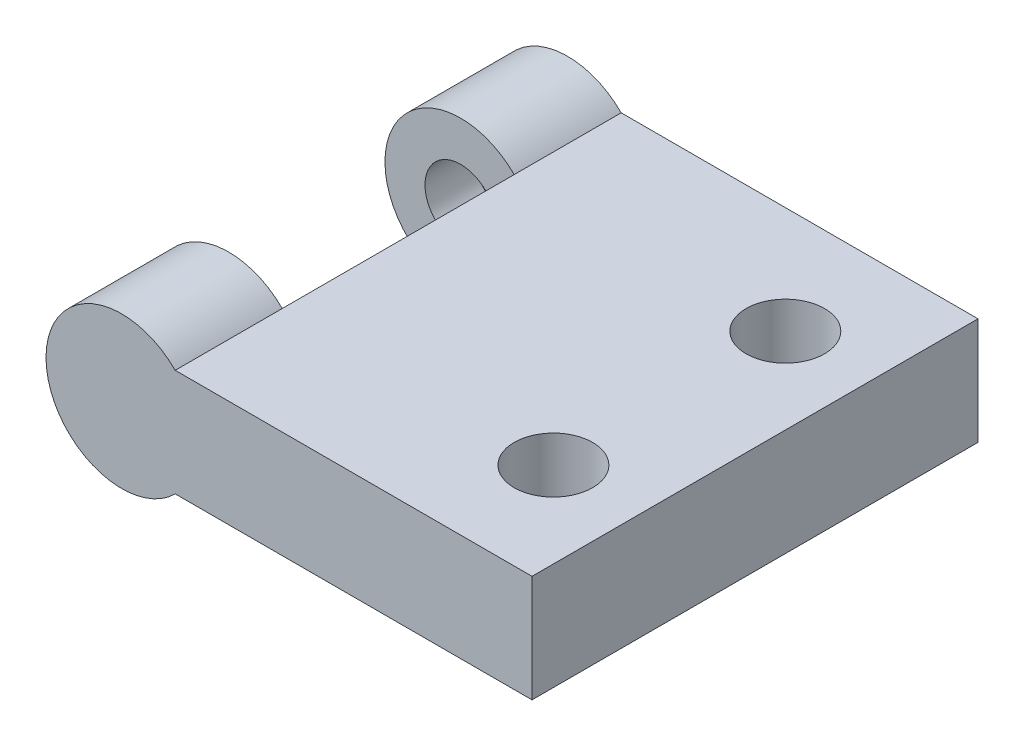
ISO-10303-21;
HEADER;
FILE_DESCRIPTION(('STEP AP214'),'2;1');
FILE_NAME('part.step','',(''),(''),'','','');
FILE_SCHEMA(('AUTOMOTIVE_DESIGN { 1 0 10303 214 1 1 1 1 }'));
ENDSEC;
DATA;
#1=APPLICATION_CONTEXT('core data for automotive mechanical design processes');
#2=APPLICATION_PROTOCOL_DEFINITION('international standard','automotive_design',2000,#1);
#3=PRODUCT_CONTEXT('',#1,'mechanical');
#4=PRODUCT('Part','Part','',(#3));
#5=PRODUCT_RELATED_PRODUCT_CATEGORY('part','',(#4));
#6=PRODUCT_DEFINITION_FORMATION('','',#4);
#7=PRODUCT_DEFINITION_CONTEXT('part definition',#1,'design');
#8=PRODUCT_DEFINITION('design','',#6,#7);
#9=PRODUCT_DEFINITION_SHAPE('','',#8);
#10=(LENGTH_UNIT() NAMED_UNIT(*) SI_UNIT(.MILLI.,.METRE.));
#11=(NAMED_UNIT(*) PLANE_ANGLE_UNIT() SI_UNIT($,.RADIAN.));
#12=(NAMED_UNIT(*) SI_UNIT($,.STERADIAN.) SOLID_ANGLE_UNIT());
#13=UNCERTAINTY_MEASURE_WITH_UNIT(LENGTH_MEASURE(1.E-05),#10,'distance_accuracy_value','');
#14=(GEOMETRIC_REPRESENTATION_CONTEXT(3) GLOBAL_UNCERTAINTY_ASSIGNED_CONTEXT((#13)) GLOBAL_UNIT_ASSIGNED_CONTEXT((#10,
#11,#12)) REPRESENTATION_CONTEXT('',''));
#15=CARTESIAN_POINT('',(0.,0.,0.));
#16=DIRECTION('',(0.,0.,1.));
#17=DIRECTION('',(1.,0.,0.));
#18=AXIS2_PLACEMENT_3D('',#15,#16,#17);
#19=CARTESIAN_POINT('',(0.,3.81,-15.875));
#20=DIRECTION('',(1.,0.,0.));
#21=DIRECTION('',(0.,0.,-1.));
#22=AXIS2_PLACEMENT_3D('',#19,#20,#21);
#23=PLANE('',#22);
#24=DIRECTION('',(0.,1.,0.));
#25=VECTOR('',#24,1.);
#26=CARTESIAN_POINT('',(0.,0.,-12.065));
#27=LINE('',#26,#25);
#28=CARTESIAN_POINT('',(0.,0.,-12.065));
#29=VERTEX_POINT('',#28);
#30=CARTESIAN_POINT('',(0.,3.81,-12.065));
#31=VERTEX_POINT('',#30);
#32=EDGE_CURVE('E97',#29,#31,#27,.T.);
#33=ORIENTED_EDGE('',*,*,#32,.F.);
#34=DIRECTION('',(0.,0.,1.));
#35=VECTOR('',#34,1.);
#36=CARTESIAN_POINT('',(0.,0.,-15.875));
#37=LINE('',#36,#35);
#38=CARTESIAN_POINT('',(0.,0.,-3.81));
#39=VERTEX_POINT('',#38);
#40=EDGE_CURVE('E85',#29,#39,#37,.T.);
#41=ORIENTED_EDGE('',*,*,#40,.T.);
#42=DIRECTION('',(0.,-1.,0.));
#43=VECTOR('',#42,1.);
#44=CARTESIAN_POINT('',(0.,0.,-3.81));
#45=LINE('',#44,#43);
#46=CARTESIAN_POINT('',(0.,3.81,-3.81));
#47=VERTEX_POINT('',#46);
#48=EDGE_CURVE('E122',#47,#39,#45,.T.);
#49=ORIENTED_EDGE('',*,*,#48,.F.);
#50=DIRECTION('',(0.,0.,1.));
#51=VECTOR('',#50,1.);
#52=CARTESIAN_POINT('',(0.,3.81,-15.875));
#53=LINE('',#52,#51);
#54=EDGE_CURVE('E49',#31,#47,#53,.T.);
#55=ORIENTED_EDGE('',*,*,#54,.F.);
#56=EDGE_LOOP('',(#33,#41,#49,#55));
#57=FACE_BOUND('',#56,.T.);
#58=ADVANCED_FACE('F35',(#57),#23,.F.);
#59=CARTESIAN_POINT('',(0.,3.81,0.));
#60=DIRECTION('',(0.,0.,-1.));
#61=DIRECTION('',(-1.,0.,0.));
#62=AXIS2_PLACEMENT_3D('',#59,#60,#61);
#63=PLANE('',#62);
#64=DIRECTION('',(1.,0.,0.));
#65=VECTOR('',#64,1.);
#66=CARTESIAN_POINT('',(0.,0.,0.));
#67=LINE('',#66,#65);
#68=CARTESIAN_POINT('',(0.,0.,0.));
#69=VERTEX_POINT('',#68);
#70=CARTESIAN_POINT('',(12.7,0.,0.));
#71=VERTEX_POINT('',#70);
#72=EDGE_CURVE('E108',#69,#71,#67,.T.);
#73=ORIENTED_EDGE('',*,*,#72,.T.);
#74=DIRECTION('',(0.,-1.,0.));
#75=VECTOR('',#74,1.);
#76=CARTESIAN_POINT('',(12.7,3.81,0.));
#77=LINE('',#76,#75);
#78=CARTESIAN_POINT('',(12.7,3.81,0.));
#79=VERTEX_POINT('',#78);
#80=EDGE_CURVE('E11',#79,#71,#77,.T.);
#81=ORIENTED_EDGE('',*,*,#80,.F.);
#82=DIRECTION('',(1.,0.,0.));
#83=VECTOR('',#82,1.);
#84=CARTESIAN_POINT('',(0.,3.81,0.));
#85=LINE('',#84,#83);
#86=CARTESIAN_POINT('',(0.,3.81,0.));
#87=VERTEX_POINT('',#86);
#88=EDGE_CURVE('E145',#87,#79,#85,.T.);
#89=ORIENTED_EDGE('',*,*,#88,.F.);
#90=CARTESIAN_POINT('',(-1.905,1.905,0.));
#91=DIRECTION('',(0.,0.,1.));
#92=DIRECTION('',(1.,0.,0.));
#93=AXIS2_PLACEMENT_3D('',#90,#91,#92);
#94=CIRCLE('',#93,2.69407683632075);
#95=EDGE_CURVE('E120',#87,#69,#94,.T.);
#96=ORIENTED_EDGE('',*,*,#95,.T.);
#97=EDGE_LOOP('',(#73,#81,#89,#96));
#98=FACE_BOUND('',#97,.T.);
#99=ADVANCED_FACE('F167',(#98),#63,.F.);
#100=CARTESIAN_POINT('',(12.7,3.81,0.));
#101=DIRECTION('',(-1.,0.,0.));
#102=DIRECTION('',(0.,0.,1.));
#103=AXIS2_PLACEMENT_3D('',#100,#101,#102);
#104=PLANE('',#103);
#105=DIRECTION('',(0.,0.,-1.));
#106=VECTOR('',#105,1.);
#107=CARTESIAN_POINT('',(12.7,0.,0.));
#108=LINE('',#107,#106);
#109=CARTESIAN_POINT('',(12.7,0.,-15.875));
#110=VERTEX_POINT('',#109);
#111=EDGE_CURVE('E152',#71,#110,#108,.T.);
#112=ORIENTED_EDGE('',*,*,#111,.T.);
#113=DIRECTION('',(0.,-1.,0.));
#114=VECTOR('',#113,1.);
#115=CARTESIAN_POINT('',(12.7,3.81,-15.875));
#116=LINE('',#115,#114);
#117=CARTESIAN_POINT('',(12.7,3.81,-15.875));
#118=VERTEX_POINT('',#117);
#119=EDGE_CURVE('E42',#118,#110,#116,.T.);
#120=ORIENTED_EDGE('',*,*,#119,.F.);
#121=DIRECTION('',(0.,0.,-1.));
#122=VECTOR('',#121,1.);
#123=CARTESIAN_POINT('',(12.7,3.81,0.));
#124=LINE('',#123,#122);
#125=EDGE_CURVE('E147',#79,#118,#124,.T.);
#126=ORIENTED_EDGE('',*,*,#125,.F.);
#127=ORIENTED_EDGE('',*,*,#80,.T.);
#128=EDGE_LOOP('',(#112,#120,#126,#127));
#129=FACE_BOUND('',#128,.T.);
#130=ADVANCED_FACE('F163',(#129),#104,.F.);
#131=CARTESIAN_POINT('',(12.7,3.81,-15.875));
#132=DIRECTION('',(0.,0.,1.));
#133=DIRECTION('',(1.,0.,0.));
#134=AXIS2_PLACEMENT_3D('',#131,#132,#133);
#135=PLANE('',#134);
#136=DIRECTION('',(-1.,0.,0.));
#137=VECTOR('',#136,1.);
#138=CARTESIAN_POINT('',(12.7,0.,-15.875));
#139=LINE('',#138,#137);
#140=CARTESIAN_POINT('',(0.,0.,-15.875));
#141=VERTEX_POINT('',#140);
#142=EDGE_CURVE('E154',#110,#141,#139,.T.);
#143=ORIENTED_EDGE('',*,*,#142,.T.);
#144=CARTESIAN_POINT('',(-1.90499999999999,1.905,-15.875));
#145=DIRECTION('',(0.,0.,-1.));
#146=DIRECTION('',(-1.,0.,0.));
#147=AXIS2_PLACEMENT_3D('',#144,#145,#146);
#148=CIRCLE('',#147,2.69407683632074);
#149=CARTESIAN_POINT('',(0.,3.81,-15.875));
#150=VERTEX_POINT('',#149);
#151=EDGE_CURVE('E102',#141,#150,#148,.T.);
#152=ORIENTED_EDGE('',*,*,#151,.T.);
#153=DIRECTION('',(-1.,0.,0.));
#154=VECTOR('',#153,1.);
#155=CARTESIAN_POINT('',(12.7,3.81,-15.875));
#156=LINE('',#155,#154);
#157=EDGE_CURVE('E149',#118,#150,#156,.T.);
#158=ORIENTED_EDGE('',*,*,#157,.F.);
#159=ORIENTED_EDGE('',*,*,#119,.T.);
#160=EDGE_LOOP('',(#143,#152,#158,#159));
#161=FACE_BOUND('',#160,.T.);
#162=ADVANCED_FACE('F159',(#161),#135,.F.);
#163=CARTESIAN_POINT('',(0.,3.81,0.));
#164=DIRECTION('',(0.,1.,0.));
#165=DIRECTION('',(0.,0.,1.));
#166=AXIS2_PLACEMENT_3D('',#163,#164,#165);
#167=PLANE('',#166);
#168=CARTESIAN_POINT('',(9.652,3.81,-3.81));
#169=DIRECTION('',(0.,1.,0.));
#170=DIRECTION('',(0.,0.,1.));
#171=AXIS2_PLACEMENT_3D('',#168,#169,#170);
#172=CIRCLE('',#171,1.397);
#173=CARTESIAN_POINT('',(9.652,3.81,-2.413));
#174=VERTEX_POINT('',#173);
#175=EDGE_CURVE('E135',#174,#174,#172,.T.);
#176=ORIENTED_EDGE('',*,*,#175,.F.);
#177=EDGE_LOOP('',(#176));
#178=FACE_BOUND('',#177,.T.);
#179=CARTESIAN_POINT('',(9.65200000000001,3.81,-12.065));
#180=DIRECTION('',(0.,1.,0.));
#181=DIRECTION('',(0.,0.,1.));
#182=AXIS2_PLACEMENT_3D('',#179,#180,#181);
#183=CIRCLE('',#182,1.397);
#184=CARTESIAN_POINT('',(9.65200000000001,3.81,-10.668));
#185=VERTEX_POINT('',#184);
#186=EDGE_CURVE('E131',#185,#185,#183,.T.);
#187=ORIENTED_EDGE('',*,*,#186,.F.);
#188=EDGE_LOOP('',(#187));
#189=FACE_BOUND('',#188,.T.);
#190=EDGE_CURVE('E143',#150,#31,#53,.T.);
#191=ORIENTED_EDGE('',*,*,#190,.T.);
#192=ORIENTED_EDGE('',*,*,#54,.T.);
#193=DIRECTION('',(0.,0.,1.));
#194=VECTOR('',#193,1.);
#195=CARTESIAN_POINT('',(0.,3.81,-3.81));
#196=LINE('',#195,#194);
#197=EDGE_CURVE('E127',#47,#87,#196,.T.);
#198=ORIENTED_EDGE('',*,*,#197,.T.);
#199=ORIENTED_EDGE('',*,*,#88,.T.);
#200=ORIENTED_EDGE('',*,*,#125,.T.);
#201=ORIENTED_EDGE('',*,*,#157,.T.);
#202=EDGE_LOOP('',(#191,#192,#198,#199,#200,#201));
#203=FACE_BOUND('',#202,.T.);
#204=ADVANCED_FACE('F200',(#178,#189,#203),#167,.T.);
#205=CARTESIAN_POINT('',(0.,0.,0.));
#206=DIRECTION('',(0.,1.,0.));
#207=DIRECTION('',(0.,0.,1.));
#208=AXIS2_PLACEMENT_3D('',#205,#206,#207);
#209=PLANE('',#208);
#210=CARTESIAN_POINT('',(9.652,0.,-3.81));
#211=DIRECTION('',(0.,1.,0.));
#212=DIRECTION('',(0.,0.,1.));
#213=AXIS2_PLACEMENT_3D('',#210,#211,#212);
#214=CIRCLE('',#213,1.397);
#215=CARTESIAN_POINT('',(9.652,0.,-2.413));
#216=VERTEX_POINT('',#215);
#217=EDGE_CURVE('E94',#216,#216,#214,.T.);
#218=ORIENTED_EDGE('',*,*,#217,.T.);
#219=EDGE_LOOP('',(#218));
#220=FACE_BOUND('',#219,.T.);
#221=CARTESIAN_POINT('',(9.65200000000001,0.,-12.065));
#222=DIRECTION('',(0.,1.,0.));
#223=DIRECTION('',(0.,0.,1.));
#224=AXIS2_PLACEMENT_3D('',#221,#222,#223);
#225=CIRCLE('',#224,1.397);
#226=CARTESIAN_POINT('',(9.65200000000001,0.,-10.668));
#227=VERTEX_POINT('',#226);
#228=EDGE_CURVE('E138',#227,#227,#225,.T.);
#229=ORIENTED_EDGE('',*,*,#228,.T.);
#230=EDGE_LOOP('',(#229));
#231=FACE_BOUND('',#230,.T.);
#232=EDGE_CURVE('E89',#141,#29,#37,.T.);
#233=ORIENTED_EDGE('',*,*,#232,.F.);
#234=ORIENTED_EDGE('',*,*,#142,.F.);
#235=ORIENTED_EDGE('',*,*,#111,.F.);
#236=ORIENTED_EDGE('',*,*,#72,.F.);
#237=DIRECTION('',(0.,0.,1.));
#238=VECTOR('',#237,1.);
#239=CARTESIAN_POINT('',(0.,0.,-3.81));
#240=LINE('',#239,#238);
#241=EDGE_CURVE('E92',#39,#69,#240,.T.);
#242=ORIENTED_EDGE('',*,*,#241,.F.);
#243=ORIENTED_EDGE('',*,*,#40,.F.);
#244=EDGE_LOOP('',(#233,#234,#235,#236,#242,#243));
#245=FACE_BOUND('',#244,.T.);
#246=ADVANCED_FACE('F86',(#220,#231,#245),#209,.F.);
#247=CARTESIAN_POINT('',(9.65200000000001,0.,-12.065));
#248=DIRECTION('',(0.,1.,0.));
#249=DIRECTION('',(0.,0.,1.));
#250=AXIS2_PLACEMENT_3D('',#247,#248,#249);
#251=CYLINDRICAL_SURFACE('',#250,1.397);
#252=CARTESIAN_POINT('',(9.65200000000001,0.,-10.668));
#253=CARTESIAN_POINT('',(9.65200000000001,0.0396874999999999,-10.668));
#254=CARTESIAN_POINT('',(9.65200000000001,0.079375,-10.668));
#255=CARTESIAN_POINT('',(9.65200000000001,0.15875,-10.668));
#256=CARTESIAN_POINT('',(9.65200000000001,0.1984375,-10.668));
#257=CARTESIAN_POINT('',(9.65200000000001,0.2778125,-10.668));
#258=CARTESIAN_POINT('',(9.65200000000001,0.3175,-10.668));
#259=CARTESIAN_POINT('',(9.65200000000001,0.396875,-10.668));
#260=CARTESIAN_POINT('',(9.65200000000001,0.4365625,-10.668));
#261=CARTESIAN_POINT('',(9.65200000000001,0.5159375,-10.668));
#262=CARTESIAN_POINT('',(9.65200000000001,0.555625,-10.668));
#263=CARTESIAN_POINT('',(9.65200000000001,0.635,-10.668));
#264=CARTESIAN_POINT('',(9.65200000000001,0.6746875,-10.668));
#265=CARTESIAN_POINT('',(9.65200000000001,0.7540625,-10.668));
#266=CARTESIAN_POINT('',(9.65200000000001,0.79375,-10.668));
#267=CARTESIAN_POINT('',(9.65200000000001,0.873125,-10.668));
#268=CARTESIAN_POINT('',(9.65200000000001,0.9128125,-10.668));
#269=CARTESIAN_POINT('',(9.65200000000001,0.9921875,-10.668));
#270=CARTESIAN_POINT('',(9.65200000000001,1.031875,-10.668));
#271=CARTESIAN_POINT('',(9.65200000000001,1.11125,-10.668));
#272=CARTESIAN_POINT('',(9.65200000000001,1.1509375,-10.668));
#273=CARTESIAN_POINT('',(9.65200000000001,1.2303125,-10.668));
#274=CARTESIAN_POINT('',(9.65200000000001,1.27,-10.668));
#275=CARTESIAN_POINT('',(9.65200000000001,1.349375,-10.668));
#276=CARTESIAN_POINT('',(9.65200000000001,1.3890625,-10.668));
#277=CARTESIAN_POINT('',(9.65200000000001,1.4684375,-10.668));
#278=CARTESIAN_POINT('',(9.65200000000001,1.508125,-10.668));
#279=CARTESIAN_POINT('',(9.65200000000001,1.5875,-10.668));
#280=CARTESIAN_POINT('',(9.65200000000001,1.6271875,-10.668));
#281=CARTESIAN_POINT('',(9.65200000000001,1.7065625,-10.668));
#282=CARTESIAN_POINT('',(9.65200000000001,1.74625,-10.668));
#283=CARTESIAN_POINT('',(9.65200000000001,1.825625,-10.668));
#284=CARTESIAN_POINT('',(9.65200000000001,1.8653125,-10.668));
#285=CARTESIAN_POINT('',(9.65200000000001,1.9446875,-10.668));
#286=CARTESIAN_POINT('',(9.65200000000001,1.984375,-10.668));
#287=CARTESIAN_POINT('',(9.65200000000001,2.06375,-10.668));
#288=CARTESIAN_POINT('',(9.65200000000001,2.1034375,-10.668));
#289=CARTESIAN_POINT('',(9.65200000000001,2.1828125,-10.668));
#290=CARTESIAN_POINT('',(9.65200000000001,2.2225,-10.668));
#291=CARTESIAN_POINT('',(9.65200000000001,2.301875,-10.668));
#292=CARTESIAN_POINT('',(9.65200000000001,2.3415625,-10.668));
#293=CARTESIAN_POINT('',(9.65200000000001,2.4209375,-10.668));
#294=CARTESIAN_POINT('',(9.65200000000001,2.460625,-10.668));
#295=CARTESIAN_POINT('',(9.65200000000001,2.54,-10.668));
#296=CARTESIAN_POINT('',(9.65200000000001,2.5796875,-10.668));
#297=CARTESIAN_POINT('',(9.65200000000001,2.6590625,-10.668));
#298=CARTESIAN_POINT('',(9.65200000000001,2.69875,-10.668));
#299=CARTESIAN_POINT('',(9.65200000000001,2.778125,-10.668));
#300=CARTESIAN_POINT('',(9.65200000000001,2.8178125,-10.668));
#301=CARTESIAN_POINT('',(9.65200000000001,2.8971875,-10.668));
#302=CARTESIAN_POINT('',(9.65200000000001,2.936875,-10.668));
#303=CARTESIAN_POINT('',(9.65200000000001,3.01625,-10.668));
#304=CARTESIAN_POINT('',(9.65200000000001,3.0559375,-10.668));
#305=CARTESIAN_POINT('',(9.65200000000001,3.1353125,-10.668));
#306=CARTESIAN_POINT('',(9.65200000000001,3.175,-10.668));
#307=CARTESIAN_POINT('',(9.65200000000001,3.254375,-10.668));
#308=CARTESIAN_POINT('',(9.65200000000001,3.2940625,-10.668));
#309=CARTESIAN_POINT('',(9.65200000000001,3.3734375,-10.668));
#310=CARTESIAN_POINT('',(9.65200000000001,3.413125,-10.668));
#311=CARTESIAN_POINT('',(9.65200000000001,3.4925,-10.668));
#312=CARTESIAN_POINT('',(9.65200000000001,3.5321875,-10.668));
#313=CARTESIAN_POINT('',(9.65200000000001,3.6115625,-10.668));
#314=CARTESIAN_POINT('',(9.65200000000001,3.65125,-10.668));
#315=CARTESIAN_POINT('',(9.65200000000001,3.730625,-10.668));
#316=CARTESIAN_POINT('',(9.65200000000001,3.7703125,-10.668));
#317=CARTESIAN_POINT('',(9.65200000000001,3.81,-10.668));
#318=B_SPLINE_CURVE_WITH_KNOTS('',3,(#252,#253,#254,#255,#256,#257,#258,#259,#260,#261,#262,
#263,#264,#265,#266,#267,#268,#269,#270,#271,#272,#273,#274,#275,#276,#277,#278,#279,#280,#281,
#282,#283,#284,#285,#286,#287,#288,#289,#290,#291,#292,#293,#294,#295,#296,#297,#298,#299,#300,
#301,#302,#303,#304,#305,#306,#307,#308,#309,#310,#311,#312,#313,#314,#315,#316,#317),
.UNSPECIFIED.,.F.,.F.,(4,2,2,2,2,2,2,2,2,2,2,2,2,2,2,2,2,2,2,2,2,2,2,2,2,2,2,2,2,2,2,2,4),(0.,
0.1190625,0.238125,0.3571875,0.47625,0.5953125,0.714375,0.8334375,0.9525,1.0715625,1.190625,
1.3096875,1.42875,1.5478125,1.666875,1.7859375,1.905,2.0240625,2.143125,2.2621875,2.38125,
2.5003125,2.619375,2.7384375,2.8575,2.9765625,3.095625,3.2146875,3.33375,3.4528125,3.571875,
3.6909375,3.81),.UNSPECIFIED.);
#319=EDGE_CURVE('BSEAM203',#227,#185,#318,.T.);
#320=ORIENTED_EDGE('',*,*,#228,.F.);
#321=ORIENTED_EDGE('',*,*,#186,.T.);
#322=ORIENTED_EDGE('',*,*,#319,.T.);
#323=ORIENTED_EDGE('',*,*,#319,.F.);
#324=EDGE_LOOP('',(#320,#322,#321,#323));
#325=FACE_BOUND('',#324,.T.);
#326=ADVANCED_FACE('F203',(#325),#251,.F.);
#327=CARTESIAN_POINT('',(9.652,0.,-3.81));
#328=DIRECTION('',(0.,1.,0.));
#329=DIRECTION('',(0.,0.,1.));
#330=AXIS2_PLACEMENT_3D('',#327,#328,#329);
#331=CYLINDRICAL_SURFACE('',#330,1.397);
#332=CARTESIAN_POINT('',(9.652,0.,-2.413));
#333=CARTESIAN_POINT('',(9.652,0.0396874999999999,-2.413));
#334=CARTESIAN_POINT('',(9.652,0.079375,-2.413));
#335=CARTESIAN_POINT('',(9.652,0.15875,-2.413));
#336=CARTESIAN_POINT('',(9.652,0.1984375,-2.413));
#337=CARTESIAN_POINT('',(9.652,0.2778125,-2.413));
#338=CARTESIAN_POINT('',(9.652,0.3175,-2.413));
#339=CARTESIAN_POINT('',(9.652,0.396875,-2.413));
#340=CARTESIAN_POINT('',(9.652,0.4365625,-2.413));
#341=CARTESIAN_POINT('',(9.652,0.5159375,-2.413));
#342=CARTESIAN_POINT('',(9.652,0.555625,-2.413));
#343=CARTESIAN_POINT('',(9.652,0.635,-2.413));
#344=CARTESIAN_POINT('',(9.652,0.6746875,-2.413));
#345=CARTESIAN_POINT('',(9.652,0.7540625,-2.413));
#346=CARTESIAN_POINT('',(9.652,0.79375,-2.413));
#347=CARTESIAN_POINT('',(9.652,0.873125,-2.413));
#348=CARTESIAN_POINT('',(9.652,0.9128125,-2.413));
#349=CARTESIAN_POINT('',(9.652,0.9921875,-2.413));
#350=CARTESIAN_POINT('',(9.652,1.031875,-2.413));
#351=CARTESIAN_POINT('',(9.652,1.11125,-2.413));
#352=CARTESIAN_POINT('',(9.652,1.1509375,-2.413));
#353=CARTESIAN_POINT('',(9.652,1.2303125,-2.413));
#354=CARTESIAN_POINT('',(9.652,1.27,-2.413));
#355=CARTESIAN_POINT('',(9.652,1.349375,-2.413));
#356=CARTESIAN_POINT('',(9.652,1.3890625,-2.413));
#357=CARTESIAN_POINT('',(9.652,1.4684375,-2.413));
#358=CARTESIAN_POINT('',(9.652,1.508125,-2.413));
#359=CARTESIAN_POINT('',(9.652,1.5875,-2.413));
#360=CARTESIAN_POINT('',(9.652,1.6271875,-2.413));
#361=CARTESIAN_POINT('',(9.652,1.7065625,-2.413));
#362=CARTESIAN_POINT('',(9.652,1.74625,-2.413));
#363=CARTESIAN_POINT('',(9.652,1.825625,-2.413));
#364=CARTESIAN_POINT('',(9.652,1.8653125,-2.413));
#365=CARTESIAN_POINT('',(9.652,1.9446875,-2.413));
#366=CARTESIAN_POINT('',(9.652,1.984375,-2.413));
#367=CARTESIAN_POINT('',(9.652,2.06375,-2.413));
#368=CARTESIAN_POINT('',(9.652,2.1034375,-2.413));
#369=CARTESIAN_POINT('',(9.652,2.1828125,-2.413));
#370=CARTESIAN_POINT('',(9.652,2.2225,-2.413));
#371=CARTESIAN_POINT('',(9.652,2.301875,-2.413));
#372=CARTESIAN_POINT('',(9.652,2.3415625,-2.413));
#373=CARTESIAN_POINT('',(9.652,2.4209375,-2.413));
#374=CARTESIAN_POINT('',(9.652,2.460625,-2.413));
#375=CARTESIAN_POINT('',(9.652,2.54,-2.413));
#376=CARTESIAN_POINT('',(9.652,2.5796875,-2.413));
#377=CARTESIAN_POINT('',(9.652,2.6590625,-2.413));
#378=CARTESIAN_POINT('',(9.652,2.69875,-2.413));
#379=CARTESIAN_POINT('',(9.652,2.778125,-2.413));
#380=CARTESIAN_POINT('',(9.652,2.8178125,-2.413));
#381=CARTESIAN_POINT('',(9.652,2.8971875,-2.413));
#382=CARTESIAN_POINT('',(9.652,2.936875,-2.413));
#383=CARTESIAN_POINT('',(9.652,3.01625,-2.413));
#384=CARTESIAN_POINT('',(9.652,3.0559375,-2.413));
#385=CARTESIAN_POINT('',(9.652,3.1353125,-2.413));
#386=CARTESIAN_POINT('',(9.652,3.175,-2.413));
#387=CARTESIAN_POINT('',(9.652,3.254375,-2.413));
#388=CARTESIAN_POINT('',(9.652,3.2940625,-2.413));
#389=CARTESIAN_POINT('',(9.652,3.3734375,-2.413));
#390=CARTESIAN_POINT('',(9.652,3.413125,-2.413));
#391=CARTESIAN_POINT('',(9.652,3.4925,-2.413));
#392=CARTESIAN_POINT('',(9.652,3.5321875,-2.413));
#393=CARTESIAN_POINT('',(9.652,3.6115625,-2.413));
#394=CARTESIAN_POINT('',(9.652,3.65125,-2.413));
#395=CARTESIAN_POINT('',(9.652,3.730625,-2.413));
#396=CARTESIAN_POINT('',(9.652,3.7703125,-2.413));
#397=CARTESIAN_POINT('',(9.652,3.81,-2.413));
#398=B_SPLINE_CURVE_WITH_KNOTS('',3,(#332,#333,#334,#335,#336,#337,#338,#339,#340,#341,#342,
#343,#344,#345,#346,#347,#348,#349,#350,#351,#352,#353,#354,#355,#356,#357,#358,#359,#360,#361,
#362,#363,#364,#365,#366,#367,#368,#369,#370,#371,#372,#373,#374,#375,#376,#377,#378,#379,#380,
#381,#382,#383,#384,#385,#386,#387,#388,#389,#390,#391,#392,#393,#394,#395,#396,#397),
.UNSPECIFIED.,.F.,.F.,(4,2,2,2,2,2,2,2,2,2,2,2,2,2,2,2,2,2,2,2,2,2,2,2,2,2,2,2,2,2,2,2,4),(0.,
0.1190625,0.238125,0.3571875,0.47625,0.5953125,0.714375,0.8334375,0.9525,1.0715625,1.190625,
1.3096875,1.42875,1.5478125,1.666875,1.7859375,1.905,2.0240625,2.143125,2.2621875,2.38125,
2.5003125,2.619375,2.7384375,2.8575,2.9765625,3.095625,3.2146875,3.33375,3.4528125,3.571875,
3.6909375,3.81),.UNSPECIFIED.);
#399=EDGE_CURVE('BSEAM186',#216,#174,#398,.T.);
#400=ORIENTED_EDGE('',*,*,#217,.F.);
#401=ORIENTED_EDGE('',*,*,#175,.T.);
#402=ORIENTED_EDGE('',*,*,#399,.T.);
#403=ORIENTED_EDGE('',*,*,#399,.F.);
#404=EDGE_LOOP('',(#400,#402,#401,#403));
#405=FACE_BOUND('',#404,.T.);
#406=ADVANCED_FACE('F186',(#405),#331,.F.);
#407=CARTESIAN_POINT('',(-1.905,1.905,-3.81));
#408=DIRECTION('',(0.,0.,1.));
#409=DIRECTION('',(1.,0.,0.));
#410=AXIS2_PLACEMENT_3D('',#407,#408,#409);
#411=CYLINDRICAL_SURFACE('',#410,2.69407683632075);
#412=ORIENTED_EDGE('',*,*,#95,.F.);
#413=ORIENTED_EDGE('',*,*,#197,.F.);
#414=CARTESIAN_POINT('',(-1.905,1.905,-3.81));
#415=DIRECTION('',(0.,0.,1.));
#416=DIRECTION('',(1.,0.,0.));
#417=AXIS2_PLACEMENT_3D('',#414,#415,#416);
#418=CIRCLE('',#417,2.69407683632075);
#419=EDGE_CURVE('E124',#47,#39,#418,.T.);
#420=ORIENTED_EDGE('',*,*,#419,.T.);
#421=ORIENTED_EDGE('',*,*,#241,.T.);
#422=EDGE_LOOP('',(#412,#413,#420,#421));
#423=FACE_BOUND('',#422,.T.);
#424=ADVANCED_FACE('F171',(#423),#411,.T.);
#425=CARTESIAN_POINT('',(0.,0.,-3.81));
#426=DIRECTION('',(0.,0.,1.));
#427=DIRECTION('',(1.,0.,0.));
#428=AXIS2_PLACEMENT_3D('',#425,#426,#427);
#429=PLANE('',#428);
#430=CARTESIAN_POINT('',(-1.905,1.905,-3.81));
#431=DIRECTION('',(0.,0.,-1.));
#432=DIRECTION('',(-1.,0.,0.));
#433=AXIS2_PLACEMENT_3D('',#430,#431,#432);
#434=CIRCLE('',#433,1.27);
#435=CARTESIAN_POINT('',(-3.175,1.905,-3.81));
#436=VERTEX_POINT('',#435);
#437=EDGE_CURVE('E110',#436,#436,#434,.T.);
#438=ORIENTED_EDGE('',*,*,#437,.F.);
#439=EDGE_LOOP('',(#438));
#440=FACE_BOUND('',#439,.T.);
#441=ORIENTED_EDGE('',*,*,#48,.T.);
#442=ORIENTED_EDGE('',*,*,#419,.F.);
#443=EDGE_LOOP('',(#441,#442));
#444=FACE_BOUND('',#443,.T.);
#445=ADVANCED_FACE('F174',(#440,#444),#429,.F.);
#446=CARTESIAN_POINT('',(-1.905,1.905,-2.032));
#447=DIRECTION('',(0.,0.,-1.));
#448=DIRECTION('',(-1.,0.,0.));
#449=AXIS2_PLACEMENT_3D('',#446,#447,#448);
#450=CYLINDRICAL_SURFACE('',#449,1.27);
#451=CARTESIAN_POINT('',(-1.905,1.905,-2.032));
#452=DIRECTION('',(0.,0.,-1.));
#453=DIRECTION('',(-1.,0.,0.));
#454=AXIS2_PLACEMENT_3D('',#451,#452,#453);
#455=CIRCLE('',#454,1.27);
#456=CARTESIAN_POINT('',(-3.175,1.905,-2.032));
#457=VERTEX_POINT('',#456);
#458=EDGE_CURVE('E113',#457,#457,#455,.T.);
#459=ORIENTED_EDGE('',*,*,#458,.F.);
#460=EDGE_LOOP('',(#459));
#461=FACE_BOUND('',#460,.T.);
#462=ORIENTED_EDGE('',*,*,#437,.T.);
#463=EDGE_LOOP('',(#462));
#464=FACE_BOUND('',#463,.T.);
#465=ADVANCED_FACE('F176',(#461,#464),#450,.F.);
#466=CARTESIAN_POINT('',(-1.905,1.905,-2.032));
#467=DIRECTION('',(0.,0.,-1.));
#468=DIRECTION('',(-1.,0.,0.));
#469=AXIS2_PLACEMENT_3D('',#466,#467,#468);
#470=PLANE('',#469);
#471=ORIENTED_EDGE('',*,*,#458,.T.);
#472=EDGE_LOOP('',(#471));
#473=FACE_BOUND('',#472,.T.);
#474=ADVANCED_FACE('F183',(#473),#470,.T.);
#475=CARTESIAN_POINT('',(-1.90499999999999,1.905,-12.065));
#476=DIRECTION('',(0.,0.,-1.));
#477=DIRECTION('',(-1.,0.,0.));
#478=AXIS2_PLACEMENT_3D('',#475,#476,#477);
#479=CYLINDRICAL_SURFACE('',#478,2.69407683632074);
#480=ORIENTED_EDGE('',*,*,#151,.F.);
#481=ORIENTED_EDGE('',*,*,#232,.T.);
#482=CARTESIAN_POINT('',(-1.90499999999999,1.905,-12.065));
#483=DIRECTION('',(0.,0.,-1.));
#484=DIRECTION('',(-1.,0.,0.));
#485=AXIS2_PLACEMENT_3D('',#482,#483,#484);
#486=CIRCLE('',#485,2.69407683632074);
#487=EDGE_CURVE('E101',#29,#31,#486,.T.);
#488=ORIENTED_EDGE('',*,*,#487,.T.);
#489=ORIENTED_EDGE('',*,*,#190,.F.);
#490=EDGE_LOOP('',(#480,#481,#488,#489));
#491=FACE_BOUND('',#490,.T.);
#492=ADVANCED_FACE('F105',(#491),#479,.T.);
#493=CARTESIAN_POINT('',(0.,0.,-12.065));
#494=DIRECTION('',(0.,0.,-1.));
#495=DIRECTION('',(-1.,0.,0.));
#496=AXIS2_PLACEMENT_3D('',#493,#494,#495);
#497=PLANE('',#496);
#498=CARTESIAN_POINT('',(-1.90499999999999,1.905,-12.065));
#499=DIRECTION('',(0.,0.,1.));
#500=DIRECTION('',(1.,0.,0.));
#501=AXIS2_PLACEMENT_3D('',#498,#499,#500);
#502=CIRCLE('',#501,1.27);
#503=CARTESIAN_POINT('',(-0.634999999999992,1.905,-12.065));
#504=VERTEX_POINT('',#503);
#505=EDGE_CURVE('E317',#504,#504,#502,.T.);
#506=ORIENTED_EDGE('',*,*,#505,.F.);
#507=EDGE_LOOP('',(#506));
#508=FACE_BOUND('',#507,.T.);
#509=ORIENTED_EDGE('',*,*,#32,.T.);
#510=ORIENTED_EDGE('',*,*,#487,.F.);
#511=EDGE_LOOP('',(#509,#510));
#512=FACE_BOUND('',#511,.T.);
#513=ADVANCED_FACE('F109',(#508,#512),#497,.F.);
#514=CARTESIAN_POINT('',(-1.90499999999999,1.905,-13.843));
#515=DIRECTION('',(0.,0.,1.));
#516=DIRECTION('',(1.,0.,0.));
#517=AXIS2_PLACEMENT_3D('',#514,#515,#516);
#518=CYLINDRICAL_SURFACE('',#517,1.27);
#519=CARTESIAN_POINT('',(-1.90499999999999,1.905,-13.843));
#520=DIRECTION('',(0.,0.,1.));
#521=DIRECTION('',(1.,0.,0.));
#522=AXIS2_PLACEMENT_3D('',#519,#520,#521);
#523=CIRCLE('',#522,1.27);
#524=CARTESIAN_POINT('',(-0.634999999999992,1.905,-13.843));
#525=VERTEX_POINT('',#524);
#526=EDGE_CURVE('E118',#525,#525,#523,.T.);
#527=ORIENTED_EDGE('',*,*,#526,.F.);
#528=EDGE_LOOP('',(#527));
#529=FACE_BOUND('',#528,.T.);
#530=ORIENTED_EDGE('',*,*,#505,.T.);
#531=EDGE_LOOP('',(#530));
#532=FACE_BOUND('',#531,.T.);
#533=ADVANCED_FACE('F291',(#529,#532),#518,.F.);
#534=CARTESIAN_POINT('',(-1.90499999999999,1.905,-13.843));
#535=DIRECTION('',(0.,0.,1.));
#536=DIRECTION('',(1.,0.,0.));
#537=AXIS2_PLACEMENT_3D('',#534,#535,#536);
#538=PLANE('',#537);
#539=ORIENTED_EDGE('',*,*,#526,.T.);
#540=EDGE_LOOP('',(#539));
#541=FACE_BOUND('',#540,.T.);
#542=ADVANCED_FACE('F301',(#541),#538,.T.);
#543=CLOSED_SHELL('',(#58,#99,#130,#162,#204,#246,#326,#406,#424,#445,#465,#474,#492,#513,#533,#542));
#544=MANIFOLD_SOLID_BREP('B2',#543);
#545=ADVANCED_BREP_SHAPE_REPRESENTATION('',(#18,#544),#14);
#546=SHAPE_DEFINITION_REPRESENTATION(#9,#545);
ENDSEC;
END-ISO-10303-21;
